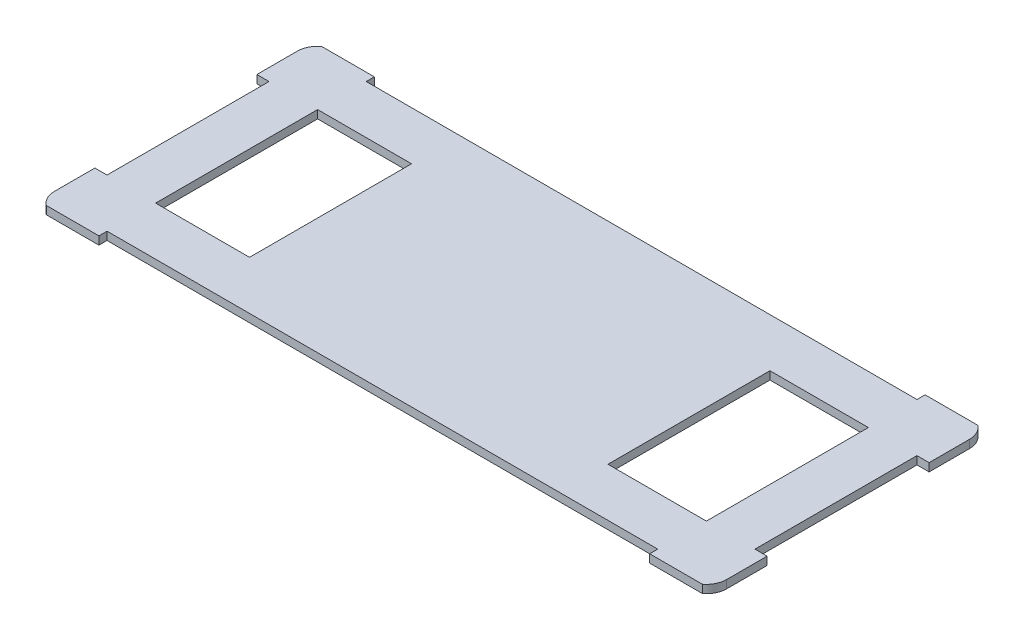
ISO-10303-21;
HEADER;
FILE_DESCRIPTION(('STEP AP214'),'2;1');
FILE_NAME('part.step','',(''),(''),'','','');
FILE_SCHEMA(('AUTOMOTIVE_DESIGN { 1 0 10303 214 1 1 1 1 }'));
ENDSEC;
DATA;
#1=APPLICATION_CONTEXT('core data for automotive mechanical design processes');
#2=APPLICATION_PROTOCOL_DEFINITION('international standard','automotive_design',2000,#1);
#3=PRODUCT_CONTEXT('',#1,'mechanical');
#4=PRODUCT('Part','Part','',(#3));
#5=PRODUCT_RELATED_PRODUCT_CATEGORY('part','',(#4));
#6=PRODUCT_DEFINITION_FORMATION('','',#4);
#7=PRODUCT_DEFINITION_CONTEXT('part definition',#1,'design');
#8=PRODUCT_DEFINITION('design','',#6,#7);
#9=PRODUCT_DEFINITION_SHAPE('','',#8);
#10=(LENGTH_UNIT() NAMED_UNIT(*) SI_UNIT(.MILLI.,.METRE.));
#11=(NAMED_UNIT(*) PLANE_ANGLE_UNIT() SI_UNIT($,.RADIAN.));
#12=(NAMED_UNIT(*) SI_UNIT($,.STERADIAN.) SOLID_ANGLE_UNIT());
#13=UNCERTAINTY_MEASURE_WITH_UNIT(LENGTH_MEASURE(1.E-05),#10,'distance_accuracy_value','');
#14=(GEOMETRIC_REPRESENTATION_CONTEXT(3) GLOBAL_UNCERTAINTY_ASSIGNED_CONTEXT((#13)) GLOBAL_UNIT_ASSIGNED_CONTEXT((#10,
#11,#12)) REPRESENTATION_CONTEXT('',''));
#15=CARTESIAN_POINT('',(0.,0.,0.));
#16=DIRECTION('',(0.,0.,1.));
#17=DIRECTION('',(1.,0.,0.));
#18=AXIS2_PLACEMENT_3D('',#15,#16,#17);
#19=CARTESIAN_POINT('',(-98.3544303797468,-0.0100000000000031,-32.8481012658228));
#20=DIRECTION('',(0.,0.,-1.));
#21=DIRECTION('',(-1.,0.,0.));
#22=AXIS2_PLACEMENT_3D('',#19,#20,#21);
#23=PLANE('',#22);
#24=DIRECTION('',(0.,1.,0.));
#25=VECTOR('',#24,1.);
#26=CARTESIAN_POINT('',(-98.3544303797468,50.,-32.8481012658228));
#27=LINE('',#26,#25);
#28=CARTESIAN_POINT('',(-98.3544303797468,1.,-32.8481012658228));
#29=VERTEX_POINT('',#28);
#30=CARTESIAN_POINT('',(-98.3544303797468,3.,-32.8481012658228));
#31=VERTEX_POINT('',#30);
#32=EDGE_CURVE('E354',#29,#31,#27,.T.);
#33=ORIENTED_EDGE('',*,*,#32,.F.);
#34=DIRECTION('',(1.,0.,0.));
#35=VECTOR('',#34,1.);
#36=CARTESIAN_POINT('',(-98.3544303797468,1.,-32.8481012658228));
#37=LINE('',#36,#35);
#38=CARTESIAN_POINT('',(-95.3544303797468,1.,-32.8481012658228));
#39=VERTEX_POINT('',#38);
#40=EDGE_CURVE('E485',#29,#39,#37,.T.);
#41=ORIENTED_EDGE('',*,*,#40,.T.);
#42=DIRECTION('',(0.,1.,0.));
#43=VECTOR('',#42,1.);
#44=CARTESIAN_POINT('',(-95.3544303797468,-0.0100000000000031,-32.8481012658228));
#45=LINE('',#44,#43);
#46=CARTESIAN_POINT('',(-95.3544303797468,3.,-32.8481012658228));
#47=VERTEX_POINT('',#46);
#48=EDGE_CURVE('E396',#39,#47,#45,.T.);
#49=ORIENTED_EDGE('',*,*,#48,.T.);
#50=DIRECTION('',(-1.,0.,0.));
#51=VECTOR('',#50,1.);
#52=CARTESIAN_POINT('',(0.,3.,-32.8481012658228));
#53=LINE('',#52,#51);
#54=EDGE_CURVE('E386',#47,#31,#53,.T.);
#55=ORIENTED_EDGE('',*,*,#54,.T.);
#56=EDGE_LOOP('',(#33,#41,#49,#55));
#57=FACE_BOUND('',#56,.T.);
#58=ADVANCED_FACE('F33',(#57),#23,.F.);
#59=CARTESIAN_POINT('',(-95.3544303797468,-0.0100000000000031,-32.8481012658228));
#60=DIRECTION('',(1.,0.,0.));
#61=DIRECTION('',(0.,0.,-1.));
#62=AXIS2_PLACEMENT_3D('',#59,#60,#61);
#63=PLANE('',#62);
#64=ORIENTED_EDGE('',*,*,#48,.F.);
#65=DIRECTION('',(0.,0.,1.));
#66=VECTOR('',#65,1.);
#67=CARTESIAN_POINT('',(-95.3544303797468,1.,-32.8481012658228));
#68=LINE('',#67,#66);
#69=CARTESIAN_POINT('',(-95.3544303797468,1.,7.15189873417722));
#70=VERTEX_POINT('',#69);
#71=EDGE_CURVE('E482',#39,#70,#68,.T.);
#72=ORIENTED_EDGE('',*,*,#71,.T.);
#73=DIRECTION('',(0.,1.,0.));
#74=VECTOR('',#73,1.);
#75=CARTESIAN_POINT('',(-95.3544303797468,-0.0100000000000031,7.15189873417722));
#76=LINE('',#75,#74);
#77=CARTESIAN_POINT('',(-95.3544303797468,3.,7.15189873417722));
#78=VERTEX_POINT('',#77);
#79=EDGE_CURVE('E427',#70,#78,#76,.T.);
#80=ORIENTED_EDGE('',*,*,#79,.T.);
#81=DIRECTION('',(0.,0.,-1.));
#82=VECTOR('',#81,1.);
#83=CARTESIAN_POINT('',(-95.3544303797468,3.,0.));
#84=LINE('',#83,#82);
#85=EDGE_CURVE('E432',#78,#47,#84,.T.);
#86=ORIENTED_EDGE('',*,*,#85,.T.);
#87=EDGE_LOOP('',(#64,#72,#80,#86));
#88=FACE_BOUND('',#87,.T.);
#89=ADVANCED_FACE('F537',(#88),#63,.F.);
#90=CARTESIAN_POINT('',(-98.3544303797468,-0.0100000000000031,7.15189873417722));
#91=DIRECTION('',(0.,0.,1.));
#92=DIRECTION('',(1.,0.,0.));
#93=AXIS2_PLACEMENT_3D('',#90,#91,#92);
#94=PLANE('',#93);
#95=ORIENTED_EDGE('',*,*,#79,.F.);
#96=DIRECTION('',(-1.,0.,0.));
#97=VECTOR('',#96,1.);
#98=CARTESIAN_POINT('',(-98.3544303797468,1.,7.15189873417722));
#99=LINE('',#98,#97);
#100=CARTESIAN_POINT('',(-98.3544303797468,1.,7.15189873417722));
#101=VERTEX_POINT('',#100);
#102=EDGE_CURVE('E479',#70,#101,#99,.T.);
#103=ORIENTED_EDGE('',*,*,#102,.T.);
#104=DIRECTION('',(0.,-1.,0.));
#105=VECTOR('',#104,1.);
#106=CARTESIAN_POINT('',(-98.3544303797468,50.,7.15189873417722));
#107=LINE('',#106,#105);
#108=CARTESIAN_POINT('',(-98.3544303797468,3.,7.15189873417722));
#109=VERTEX_POINT('',#108);
#110=EDGE_CURVE('E351',#109,#101,#107,.T.);
#111=ORIENTED_EDGE('',*,*,#110,.F.);
#112=DIRECTION('',(1.,0.,0.));
#113=VECTOR('',#112,1.);
#114=CARTESIAN_POINT('',(0.,3.,7.15189873417733));
#115=LINE('',#114,#113);
#116=EDGE_CURVE('E417',#109,#78,#115,.T.);
#117=ORIENTED_EDGE('',*,*,#116,.T.);
#118=EDGE_LOOP('',(#95,#103,#111,#117));
#119=FACE_BOUND('',#118,.T.);
#120=ADVANCED_FACE('F543',(#119),#94,.F.);
#121=CARTESIAN_POINT('',(-83.3544303797468,-0.0100000000000031,19.1518987341772));
#122=DIRECTION('',(0.,0.,-1.));
#123=DIRECTION('',(-1.,0.,0.));
#124=AXIS2_PLACEMENT_3D('',#121,#122,#123);
#125=PLANE('',#124);
#126=DIRECTION('',(0.,1.,0.));
#127=VECTOR('',#126,1.);
#128=CARTESIAN_POINT('',(-83.3544303797468,-0.0100000000000031,19.1518987341772));
#129=LINE('',#128,#127);
#130=CARTESIAN_POINT('',(-83.3544303797468,1.,19.1518987341772));
#131=VERTEX_POINT('',#130);
#132=CARTESIAN_POINT('',(-83.3544303797468,3.,19.1518987341772));
#133=VERTEX_POINT('',#132);
#134=EDGE_CURVE('E394',#131,#133,#129,.T.);
#135=ORIENTED_EDGE('',*,*,#134,.F.);
#136=DIRECTION('',(1.,0.,0.));
#137=VECTOR('',#136,1.);
#138=CARTESIAN_POINT('',(-83.3544303797468,1.,19.1518987341772));
#139=LINE('',#138,#137);
#140=CARTESIAN_POINT('',(52.6371308016878,1.,19.1518987341772));
#141=VERTEX_POINT('',#140);
#142=EDGE_CURVE('E460',#131,#141,#139,.T.);
#143=ORIENTED_EDGE('',*,*,#142,.T.);
#144=DIRECTION('',(0.,1.,0.));
#145=VECTOR('',#144,1.);
#146=CARTESIAN_POINT('',(52.6371308016878,-0.0100000000000031,19.1518987341772));
#147=LINE('',#146,#145);
#148=CARTESIAN_POINT('',(52.6371308016878,3.,19.1518987341772));
#149=VERTEX_POINT('',#148);
#150=EDGE_CURVE('E397',#141,#149,#147,.T.);
#151=ORIENTED_EDGE('',*,*,#150,.T.);
#152=DIRECTION('',(-1.,0.,0.));
#153=VECTOR('',#152,1.);
#154=CARTESIAN_POINT('',(0.,3.,19.1518987341772));
#155=LINE('',#154,#153);
#156=EDGE_CURVE('E390',#149,#133,#155,.T.);
#157=ORIENTED_EDGE('',*,*,#156,.T.);
#158=EDGE_LOOP('',(#135,#143,#151,#157));
#159=FACE_BOUND('',#158,.T.);
#160=ADVANCED_FACE('F606',(#159),#125,.F.);
#161=CARTESIAN_POINT('',(52.6371308016878,-0.0100000000000031,22.1518987341772));
#162=DIRECTION('',(1.,0.,0.));
#163=DIRECTION('',(0.,0.,-1.));
#164=AXIS2_PLACEMENT_3D('',#161,#162,#163);
#165=PLANE('',#164);
#166=ORIENTED_EDGE('',*,*,#150,.F.);
#167=DIRECTION('',(0.,0.,1.));
#168=VECTOR('',#167,1.);
#169=CARTESIAN_POINT('',(52.6371308016878,1.,22.1518987341772));
#170=LINE('',#169,#168);
#171=CARTESIAN_POINT('',(52.637130801688,1.,21.1483717721465));
#172=VERTEX_POINT('',#171);
#173=EDGE_CURVE('E458',#141,#172,#170,.T.);
#174=ORIENTED_EDGE('',*,*,#173,.T.);
#175=DIRECTION('',(0.,1.,0.));
#176=VECTOR('',#175,1.);
#177=CARTESIAN_POINT('',(52.6371308016878,-0.0100000000000031,21.1483717721465));
#178=LINE('',#177,#176);
#179=CARTESIAN_POINT('',(52.6371308016878,3.,21.1483717721465));
#180=VERTEX_POINT('',#179);
#181=EDGE_CURVE('E308',#172,#180,#178,.T.);
#182=ORIENTED_EDGE('',*,*,#181,.T.);
#183=DIRECTION('',(0.,0.,-1.));
#184=VECTOR('',#183,1.);
#185=CARTESIAN_POINT('',(52.6371308016879,3.,2.43495644026E-13));
#186=LINE('',#185,#184);
#187=EDGE_CURVE('E387',#180,#149,#186,.T.);
#188=ORIENTED_EDGE('',*,*,#187,.T.);
#189=EDGE_LOOP('',(#166,#174,#182,#188));
#190=FACE_BOUND('',#189,.T.);
#191=ADVANCED_FACE('F456',(#190),#165,.F.);
#192=CARTESIAN_POINT('',(-83.3544303797468,-0.0100000000000031,22.1518987341772));
#193=DIRECTION('',(-1.,0.,0.));
#194=DIRECTION('',(0.,0.,1.));
#195=AXIS2_PLACEMENT_3D('',#192,#193,#194);
#196=PLANE('',#195);
#197=DIRECTION('',(0.,-1.,0.));
#198=VECTOR('',#197,1.);
#199=CARTESIAN_POINT('',(-83.3544303797468,-0.0100000000000031,21.1483717721465));
#200=LINE('',#199,#198);
#201=CARTESIAN_POINT('',(-83.3544303797468,3.,21.1483717721465));
#202=VERTEX_POINT('',#201);
#203=CARTESIAN_POINT('',(-83.3544303797468,1.,21.1483717721465));
#204=VERTEX_POINT('',#203);
#205=EDGE_CURVE('E303',#202,#204,#200,.T.);
#206=ORIENTED_EDGE('',*,*,#205,.T.);
#207=DIRECTION('',(0.,0.,-1.));
#208=VECTOR('',#207,1.);
#209=CARTESIAN_POINT('',(-83.3544303797468,1.,22.1518987341772));
#210=LINE('',#209,#208);
#211=EDGE_CURVE('E463',#204,#131,#210,.T.);
#212=ORIENTED_EDGE('',*,*,#211,.T.);
#213=ORIENTED_EDGE('',*,*,#134,.T.);
#214=DIRECTION('',(0.,0.,1.));
#215=VECTOR('',#214,1.);
#216=CARTESIAN_POINT('',(-83.3544303797468,3.,0.));
#217=LINE('',#216,#215);
#218=EDGE_CURVE('E383',#133,#202,#217,.T.);
#219=ORIENTED_EDGE('',*,*,#218,.T.);
#220=EDGE_LOOP('',(#206,#212,#213,#219));
#221=FACE_BOUND('',#220,.T.);
#222=ADVANCED_FACE('F571',(#221),#196,.F.);
#223=CARTESIAN_POINT('',(64.6371308016878,-0.0100000000000031,7.15189873417722));
#224=DIRECTION('',(0.,0.,1.));
#225=DIRECTION('',(1.,0.,0.));
#226=AXIS2_PLACEMENT_3D('',#223,#224,#225);
#227=PLANE('',#226);
#228=DIRECTION('',(0.,1.,0.));
#229=VECTOR('',#228,1.);
#230=CARTESIAN_POINT('',(67.6371308016878,-0.0100000000000031,7.15189873417722));
#231=LINE('',#230,#229);
#232=CARTESIAN_POINT('',(67.6371308016878,1.,7.15189873417722));
#233=VERTEX_POINT('',#232);
#234=CARTESIAN_POINT('',(67.6371308016878,3.,7.15189873417722));
#235=VERTEX_POINT('',#234);
#236=EDGE_CURVE('E415',#233,#235,#231,.T.);
#237=ORIENTED_EDGE('',*,*,#236,.F.);
#238=DIRECTION('',(-1.,0.,0.));
#239=VECTOR('',#238,1.);
#240=CARTESIAN_POINT('',(64.6371308016878,1.,7.15189873417722));
#241=LINE('',#240,#239);
#242=CARTESIAN_POINT('',(64.6371308016878,1.,7.15189873417722));
#243=VERTEX_POINT('',#242);
#244=EDGE_CURVE('E297',#233,#243,#241,.T.);
#245=ORIENTED_EDGE('',*,*,#244,.T.);
#246=DIRECTION('',(0.,1.,0.));
#247=VECTOR('',#246,1.);
#248=CARTESIAN_POINT('',(64.6371308016878,-0.0100000000000031,7.15189873417722));
#249=LINE('',#248,#247);
#250=CARTESIAN_POINT('',(64.6371308016878,3.,7.15189873417722));
#251=VERTEX_POINT('',#250);
#252=EDGE_CURVE('E399',#243,#251,#249,.T.);
#253=ORIENTED_EDGE('',*,*,#252,.T.);
#254=DIRECTION('',(1.,0.,0.));
#255=VECTOR('',#254,1.);
#256=CARTESIAN_POINT('',(0.,3.,7.15189873417722));
#257=LINE('',#256,#255);
#258=EDGE_CURVE('E393',#251,#235,#257,.T.);
#259=ORIENTED_EDGE('',*,*,#258,.T.);
#260=EDGE_LOOP('',(#237,#245,#253,#259));
#261=FACE_BOUND('',#260,.T.);
#262=ADVANCED_FACE('F569',(#261),#227,.F.);
#263=CARTESIAN_POINT('',(64.6371308016878,-0.0100000000000031,-32.8481012658228));
#264=DIRECTION('',(0.,0.,-1.));
#265=DIRECTION('',(-1.,0.,0.));
#266=AXIS2_PLACEMENT_3D('',#263,#264,#265);
#267=PLANE('',#266);
#268=DIRECTION('',(0.,1.,0.));
#269=VECTOR('',#268,1.);
#270=CARTESIAN_POINT('',(64.6371308016878,-0.0100000000000031,-32.8481012658228));
#271=LINE('',#270,#269);
#272=CARTESIAN_POINT('',(64.6371308016878,1.,-32.8481012658228));
#273=VERTEX_POINT('',#272);
#274=CARTESIAN_POINT('',(64.6371308016878,3.,-32.8481012658228));
#275=VERTEX_POINT('',#274);
#276=EDGE_CURVE('E400',#273,#275,#271,.T.);
#277=ORIENTED_EDGE('',*,*,#276,.F.);
#278=DIRECTION('',(1.,0.,0.));
#279=VECTOR('',#278,1.);
#280=CARTESIAN_POINT('',(64.6371308016878,1.,-32.8481012658228));
#281=LINE('',#280,#279);
#282=CARTESIAN_POINT('',(67.6371308016878,1.,-32.8481012658228));
#283=VERTEX_POINT('',#282);
#284=EDGE_CURVE('E294',#273,#283,#281,.T.);
#285=ORIENTED_EDGE('',*,*,#284,.T.);
#286=DIRECTION('',(0.,-1.,0.));
#287=VECTOR('',#286,1.);
#288=CARTESIAN_POINT('',(67.6371308016878,50.,-32.8481012658228));
#289=LINE('',#288,#287);
#290=CARTESIAN_POINT('',(67.6371308016878,3.,-32.8481012658228));
#291=VERTEX_POINT('',#290);
#292=EDGE_CURVE('E355',#291,#283,#289,.T.);
#293=ORIENTED_EDGE('',*,*,#292,.F.);
#294=DIRECTION('',(-1.,0.,0.));
#295=VECTOR('',#294,1.);
#296=CARTESIAN_POINT('',(0.,3.,-32.8481012658228));
#297=LINE('',#296,#295);
#298=EDGE_CURVE('E407',#291,#275,#297,.T.);
#299=ORIENTED_EDGE('',*,*,#298,.T.);
#300=EDGE_LOOP('',(#277,#285,#293,#299));
#301=FACE_BOUND('',#300,.T.);
#302=ADVANCED_FACE('F518',(#301),#267,.F.);
#303=CARTESIAN_POINT('',(64.6371308016878,-0.0100000000000031,7.15189873417722));
#304=DIRECTION('',(-1.,0.,0.));
#305=DIRECTION('',(0.,0.,1.));
#306=AXIS2_PLACEMENT_3D('',#303,#304,#305);
#307=PLANE('',#306);
#308=ORIENTED_EDGE('',*,*,#252,.F.);
#309=DIRECTION('',(0.,0.,-1.));
#310=VECTOR('',#309,1.);
#311=CARTESIAN_POINT('',(64.6371308016878,1.,7.15189873417722));
#312=LINE('',#311,#310);
#313=EDGE_CURVE('E291',#243,#273,#312,.T.);
#314=ORIENTED_EDGE('',*,*,#313,.T.);
#315=ORIENTED_EDGE('',*,*,#276,.T.);
#316=DIRECTION('',(0.,0.,1.));
#317=VECTOR('',#316,1.);
#318=CARTESIAN_POINT('',(64.6371308016878,3.,0.));
#319=LINE('',#318,#317);
#320=EDGE_CURVE('E410',#275,#251,#319,.T.);
#321=ORIENTED_EDGE('',*,*,#320,.T.);
#322=EDGE_LOOP('',(#308,#314,#315,#321));
#323=FACE_BOUND('',#322,.T.);
#324=ADVANCED_FACE('F568',(#323),#307,.F.);
#325=CARTESIAN_POINT('',(52.6371308016878,-0.0100000000000031,-44.8481012658228));
#326=DIRECTION('',(0.,0.,1.));
#327=DIRECTION('',(1.,0.,0.));
#328=AXIS2_PLACEMENT_3D('',#325,#326,#327);
#329=PLANE('',#328);
#330=DIRECTION('',(0.,1.,0.));
#331=VECTOR('',#330,1.);
#332=CARTESIAN_POINT('',(52.6371308016878,-0.0100000000000031,-44.8481012658228));
#333=LINE('',#332,#331);
#334=CARTESIAN_POINT('',(52.6371308016878,1.,-44.8481012658228));
#335=VERTEX_POINT('',#334);
#336=CARTESIAN_POINT('',(52.6371308016878,3.,-44.8481012658228));
#337=VERTEX_POINT('',#336);
#338=EDGE_CURVE('E402',#335,#337,#333,.T.);
#339=ORIENTED_EDGE('',*,*,#338,.F.);
#340=DIRECTION('',(-1.,0.,0.));
#341=VECTOR('',#340,1.);
#342=CARTESIAN_POINT('',(52.6371308016878,1.,-44.8481012658228));
#343=LINE('',#342,#341);
#344=CARTESIAN_POINT('',(-83.3544303797469,1.,-44.8481012658228));
#345=VERTEX_POINT('',#344);
#346=EDGE_CURVE('E258',#335,#345,#343,.T.);
#347=ORIENTED_EDGE('',*,*,#346,.T.);
#348=DIRECTION('',(0.,1.,0.));
#349=VECTOR('',#348,1.);
#350=CARTESIAN_POINT('',(-83.3544303797469,-0.0100000000000031,-44.8481012658228));
#351=LINE('',#350,#349);
#352=CARTESIAN_POINT('',(-83.3544303797469,3.,-44.8481012658228));
#353=VERTEX_POINT('',#352);
#354=EDGE_CURVE('E327',#345,#353,#351,.T.);
#355=ORIENTED_EDGE('',*,*,#354,.T.);
#356=DIRECTION('',(1.,0.,0.));
#357=VECTOR('',#356,1.);
#358=CARTESIAN_POINT('',(0.,3.,-44.8481012658228));
#359=LINE('',#358,#357);
#360=EDGE_CURVE('E423',#353,#337,#359,.T.);
#361=ORIENTED_EDGE('',*,*,#360,.T.);
#362=EDGE_LOOP('',(#339,#347,#355,#361));
#363=FACE_BOUND('',#362,.T.);
#364=ADVANCED_FACE('F498',(#363),#329,.F.);
#365=CARTESIAN_POINT('',(-83.3544303797469,-0.0100000000000031,-44.8481012658228));
#366=DIRECTION('',(-1.,0.,0.));
#367=DIRECTION('',(0.,0.,1.));
#368=AXIS2_PLACEMENT_3D('',#365,#366,#367);
#369=PLANE('',#368);
#370=DIRECTION('',(0.,0.,-1.));
#371=VECTOR('',#370,1.);
#372=CARTESIAN_POINT('',(-83.3544303797469,1.,-44.8481012658228));
#373=LINE('',#372,#371);
#374=CARTESIAN_POINT('',(-83.3544303797469,1.,-46.8481012658228));
#375=VERTEX_POINT('',#374);
#376=EDGE_CURVE('E264',#345,#375,#373,.T.);
#377=ORIENTED_EDGE('',*,*,#376,.T.);
#378=DIRECTION('',(0.,1.,0.));
#379=VECTOR('',#378,1.);
#380=CARTESIAN_POINT('',(-83.3544303797469,-0.0100000000000034,-46.8481012658228));
#381=LINE('',#380,#379);
#382=CARTESIAN_POINT('',(-83.3544303797469,3.,-46.8481012658228));
#383=VERTEX_POINT('',#382);
#384=EDGE_CURVE('E56',#375,#383,#381,.T.);
#385=ORIENTED_EDGE('',*,*,#384,.T.);
#386=DIRECTION('',(0.,0.,1.));
#387=VECTOR('',#386,1.);
#388=CARTESIAN_POINT('',(-83.3544303797469,3.,0.));
#389=LINE('',#388,#387);
#390=EDGE_CURVE('E426',#383,#353,#389,.T.);
#391=ORIENTED_EDGE('',*,*,#390,.T.);
#392=ORIENTED_EDGE('',*,*,#354,.F.);
#393=EDGE_LOOP('',(#377,#385,#391,#392));
#394=FACE_BOUND('',#393,.T.);
#395=ADVANCED_FACE('F495',(#394),#369,.F.);
#396=CARTESIAN_POINT('',(52.6371308016878,-0.0100000000000031,-44.8481012658228));
#397=DIRECTION('',(1.,0.,0.));
#398=DIRECTION('',(0.,0.,-1.));
#399=AXIS2_PLACEMENT_3D('',#396,#397,#398);
#400=PLANE('',#399);
#401=DIRECTION('',(0.,0.,-1.));
#402=VECTOR('',#401,1.);
#403=CARTESIAN_POINT('',(52.6371308016878,3.,0.));
#404=LINE('',#403,#402);
#405=CARTESIAN_POINT('',(52.6371308016878,3.,-46.8481012658228));
#406=VERTEX_POINT('',#405);
#407=EDGE_CURVE('E252',#337,#406,#404,.T.);
#408=ORIENTED_EDGE('',*,*,#407,.T.);
#409=DIRECTION('',(0.,-1.,0.));
#410=VECTOR('',#409,1.);
#411=CARTESIAN_POINT('',(52.6371308016878,-0.0100000000000034,-46.8481012658228));
#412=LINE('',#411,#410);
#413=CARTESIAN_POINT('',(52.637130801688,1.,-46.8481012658228));
#414=VERTEX_POINT('',#413);
#415=EDGE_CURVE('E240',#406,#414,#412,.T.);
#416=ORIENTED_EDGE('',*,*,#415,.T.);
#417=DIRECTION('',(0.,0.,1.));
#418=VECTOR('',#417,1.);
#419=CARTESIAN_POINT('',(52.6371308016878,1.,-44.8481012658228));
#420=LINE('',#419,#418);
#421=EDGE_CURVE('E249',#414,#335,#420,.T.);
#422=ORIENTED_EDGE('',*,*,#421,.T.);
#423=ORIENTED_EDGE('',*,*,#338,.T.);
#424=EDGE_LOOP('',(#408,#416,#422,#423));
#425=FACE_BOUND('',#424,.T.);
#426=ADVANCED_FACE('F248',(#425),#400,.F.);
#427=CARTESIAN_POINT('',(-98.3544303797468,50.,-47.8481012658228));
#428=DIRECTION('',(1.,0.,0.));
#429=DIRECTION('',(0.,0.,-1.));
#430=AXIS2_PLACEMENT_3D('',#427,#428,#429);
#431=PLANE('',#430);
#432=DIRECTION('',(0.,-1.,0.));
#433=VECTOR('',#432,1.);
#434=CARTESIAN_POINT('',(-98.3544303797468,50.,-42.8481012658228));
#435=LINE('',#434,#433);
#436=CARTESIAN_POINT('',(-98.3544303797468,3.,-42.8481012658228));
#437=VERTEX_POINT('',#436);
#438=CARTESIAN_POINT('',(-98.3544303797468,1.,-42.8481012658228));
#439=VERTEX_POINT('',#438);
#440=EDGE_CURVE('E377',#437,#439,#435,.T.);
#441=ORIENTED_EDGE('',*,*,#440,.T.);
#442=DIRECTION('',(0.,0.,1.));
#443=VECTOR('',#442,1.);
#444=CARTESIAN_POINT('',(-98.3544303797468,1.,-47.8481012658228));
#445=LINE('',#444,#443);
#446=EDGE_CURVE('E488',#439,#29,#445,.T.);
#447=ORIENTED_EDGE('',*,*,#446,.T.);
#448=ORIENTED_EDGE('',*,*,#32,.T.);
#449=DIRECTION('',(0.,0.,-1.));
#450=VECTOR('',#449,1.);
#451=CARTESIAN_POINT('',(-98.3544303797468,3.,-47.8481012658228));
#452=LINE('',#451,#450);
#453=EDGE_CURVE('E368',#31,#437,#452,.T.);
#454=ORIENTED_EDGE('',*,*,#453,.T.);
#455=EDGE_LOOP('',(#441,#447,#448,#454));
#456=FACE_BOUND('',#455,.T.);
#457=ADVANCED_FACE('F532',(#456),#431,.F.);
#458=CARTESIAN_POINT('',(-93.3544303797468,50.,-42.8481012658228));
#459=DIRECTION('',(0.,-1.,0.));
#460=DIRECTION('',(0.,0.,-1.));
#461=AXIS2_PLACEMENT_3D('',#458,#459,#460);
#462=CYLINDRICAL_SURFACE('',#461,5.);
#463=DIRECTION('',(0.,-1.,0.));
#464=VECTOR('',#463,1.);
#465=CARTESIAN_POINT('',(-96.3544303797468,50.,-46.8481012658228));
#466=LINE('',#465,#464);
#467=CARTESIAN_POINT('',(-96.3544303797468,1.,-46.8481012658228));
#468=VERTEX_POINT('',#467);
#469=CARTESIAN_POINT('',(-96.3544303797468,3.,-46.8481012658228));
#470=VERTEX_POINT('',#469);
#471=EDGE_CURVE('E505',#468,#470,#466,.F.);
#472=ORIENTED_EDGE('',*,*,#471,.F.);
#473=CARTESIAN_POINT('',(-93.3544303797468,1.,-42.8481012658228));
#474=DIRECTION('',(0.,1.,0.));
#475=DIRECTION('',(0.,0.,1.));
#476=AXIS2_PLACEMENT_3D('',#473,#474,#475);
#477=CIRCLE('',#476,5.);
#478=EDGE_CURVE('E491',#439,#468,#477,.F.);
#479=ORIENTED_EDGE('',*,*,#478,.F.);
#480=ORIENTED_EDGE('',*,*,#440,.F.);
#481=CARTESIAN_POINT('',(-93.3544303797468,3.,-42.8481012658228));
#482=DIRECTION('',(0.,-1.,0.));
#483=DIRECTION('',(0.,0.,-1.));
#484=AXIS2_PLACEMENT_3D('',#481,#482,#483);
#485=CIRCLE('',#484,5.);
#486=EDGE_CURVE('E361',#470,#437,#485,.F.);
#487=ORIENTED_EDGE('',*,*,#486,.F.);
#488=EDGE_LOOP('',(#472,#479,#480,#487));
#489=FACE_BOUND('',#488,.T.);
#490=ADVANCED_FACE('F524',(#489),#462,.T.);
#491=CARTESIAN_POINT('',(62.6371308016877,50.,-42.8481012658228));
#492=DIRECTION('',(0.,-1.,0.));
#493=DIRECTION('',(0.,0.,-1.));
#494=AXIS2_PLACEMENT_3D('',#491,#492,#493);
#495=CYLINDRICAL_SURFACE('',#494,5.);
#496=DIRECTION('',(0.,-1.,0.));
#497=VECTOR('',#496,1.);
#498=CARTESIAN_POINT('',(65.6371308016877,50.,-46.8481012658228));
#499=LINE('',#498,#497);
#500=CARTESIAN_POINT('',(65.6371308016877,3.,-46.8481012658228));
#501=VERTEX_POINT('',#500);
#502=CARTESIAN_POINT('',(65.6371308016878,1.,-46.8481012658228));
#503=VERTEX_POINT('',#502);
#504=EDGE_CURVE('E48',#501,#503,#499,.T.);
#505=ORIENTED_EDGE('',*,*,#504,.F.);
#506=CARTESIAN_POINT('',(62.6371308016877,3.,-42.8481012658228));
#507=DIRECTION('',(0.,-1.,0.));
#508=DIRECTION('',(0.,0.,-1.));
#509=AXIS2_PLACEMENT_3D('',#506,#507,#508);
#510=CIRCLE('',#509,5.);
#511=CARTESIAN_POINT('',(67.6371308016878,3.,-42.8481012658228));
#512=VERTEX_POINT('',#511);
#513=EDGE_CURVE('E358',#512,#501,#510,.F.);
#514=ORIENTED_EDGE('',*,*,#513,.F.);
#515=DIRECTION('',(0.,-1.,0.));
#516=VECTOR('',#515,1.);
#517=CARTESIAN_POINT('',(67.6371308016878,50.,-42.8481012658228));
#518=LINE('',#517,#516);
#519=CARTESIAN_POINT('',(67.6371308016878,1.,-42.8481012658228));
#520=VERTEX_POINT('',#519);
#521=EDGE_CURVE('E371',#520,#512,#518,.F.);
#522=ORIENTED_EDGE('',*,*,#521,.F.);
#523=CARTESIAN_POINT('',(62.6371308016877,1.,-42.8481012658228));
#524=DIRECTION('',(0.,1.,0.));
#525=DIRECTION('',(0.,0.,1.));
#526=AXIS2_PLACEMENT_3D('',#523,#524,#525);
#527=CIRCLE('',#526,5.);
#528=EDGE_CURVE('E260',#503,#520,#527,.F.);
#529=ORIENTED_EDGE('',*,*,#528,.F.);
#530=EDGE_LOOP('',(#505,#514,#522,#529));
#531=FACE_BOUND('',#530,.T.);
#532=ADVANCED_FACE('F522',(#531),#495,.T.);
#533=CARTESIAN_POINT('',(67.6371308016878,50.,-47.8481012658228));
#534=DIRECTION('',(-1.,0.,0.));
#535=DIRECTION('',(0.,0.,1.));
#536=AXIS2_PLACEMENT_3D('',#533,#534,#535);
#537=PLANE('',#536);
#538=ORIENTED_EDGE('',*,*,#292,.T.);
#539=DIRECTION('',(0.,0.,1.));
#540=VECTOR('',#539,1.);
#541=CARTESIAN_POINT('',(67.6371308016878,1.,25.2768642998369));
#542=LINE('',#541,#540);
#543=EDGE_CURVE('E465',#520,#283,#542,.T.);
#544=ORIENTED_EDGE('',*,*,#543,.F.);
#545=ORIENTED_EDGE('',*,*,#521,.T.);
#546=DIRECTION('',(0.,0.,1.));
#547=VECTOR('',#546,1.);
#548=CARTESIAN_POINT('',(67.6371308016878,3.,-47.8481012658228));
#549=LINE('',#548,#547);
#550=EDGE_CURVE('E404',#512,#291,#549,.T.);
#551=ORIENTED_EDGE('',*,*,#550,.T.);
#552=EDGE_LOOP('',(#538,#544,#545,#551));
#553=FACE_BOUND('',#552,.T.);
#554=ADVANCED_FACE('F519',(#553),#537,.F.);
#555=DIRECTION('',(0.,-1.,0.));
#556=VECTOR('',#555,1.);
#557=CARTESIAN_POINT('',(67.6371308016878,50.,17.1518987341772));
#558=LINE('',#557,#556);
#559=CARTESIAN_POINT('',(67.6371308016878,3.,17.1518987341772));
#560=VERTEX_POINT('',#559);
#561=CARTESIAN_POINT('',(67.6371308016878,1.,17.1518987341772));
#562=VERTEX_POINT('',#561);
#563=EDGE_CURVE('E373',#560,#562,#558,.T.);
#564=ORIENTED_EDGE('',*,*,#563,.T.);
#565=EDGE_CURVE('E508',#233,#562,#542,.T.);
#566=ORIENTED_EDGE('',*,*,#565,.F.);
#567=ORIENTED_EDGE('',*,*,#236,.T.);
#568=EDGE_CURVE('E374',#235,#560,#549,.T.);
#569=ORIENTED_EDGE('',*,*,#568,.T.);
#570=EDGE_LOOP('',(#564,#566,#567,#569));
#571=FACE_BOUND('',#570,.T.);
#572=ADVANCED_FACE('F530',(#571),#537,.F.);
#573=CARTESIAN_POINT('',(62.6371308016878,50.,17.1518987341772));
#574=DIRECTION('',(0.,-1.,0.));
#575=DIRECTION('',(0.,0.,-1.));
#576=AXIS2_PLACEMENT_3D('',#573,#574,#575);
#577=CYLINDRICAL_SURFACE('',#576,5.);
#578=CARTESIAN_POINT('',(62.6371308016878,1.,17.1518987341772));
#579=DIRECTION('',(0.,1.,0.));
#580=DIRECTION('',(0.,0.,1.));
#581=AXIS2_PLACEMENT_3D('',#578,#579,#580);
#582=CIRCLE('',#581,5.);
#583=CARTESIAN_POINT('',(65.6418276677268,1.,21.1483717721465));
#584=VERTEX_POINT('',#583);
#585=EDGE_CURVE('E461',#562,#584,#582,.F.);
#586=ORIENTED_EDGE('',*,*,#585,.F.);
#587=ORIENTED_EDGE('',*,*,#563,.F.);
#588=CARTESIAN_POINT('',(62.6371308016878,3.,17.1518987341772));
#589=DIRECTION('',(0.,-1.,0.));
#590=DIRECTION('',(0.,0.,-1.));
#591=AXIS2_PLACEMENT_3D('',#588,#589,#590);
#592=CIRCLE('',#591,5.);
#593=CARTESIAN_POINT('',(65.6418276677268,3.,21.1483717721465));
#594=VERTEX_POINT('',#593);
#595=EDGE_CURVE('E362',#594,#560,#592,.F.);
#596=ORIENTED_EDGE('',*,*,#595,.F.);
#597=DIRECTION('',(0.,-1.,0.));
#598=VECTOR('',#597,1.);
#599=CARTESIAN_POINT('',(65.6418276677268,50.,21.1483717721465));
#600=LINE('',#599,#598);
#601=EDGE_CURVE('E306',#584,#594,#600,.F.);
#602=ORIENTED_EDGE('',*,*,#601,.F.);
#603=EDGE_LOOP('',(#586,#587,#596,#602));
#604=FACE_BOUND('',#603,.T.);
#605=ADVANCED_FACE('F552',(#604),#577,.T.);
#606=CARTESIAN_POINT('',(-93.3544303797468,50.,17.1518987341772));
#607=DIRECTION('',(0.,-1.,0.));
#608=DIRECTION('',(0.,0.,-1.));
#609=AXIS2_PLACEMENT_3D('',#606,#607,#608);
#610=CYLINDRICAL_SURFACE('',#609,5.);
#611=CARTESIAN_POINT('',(-93.3544303797468,1.,17.1518987341772));
#612=DIRECTION('',(0.,1.,0.));
#613=DIRECTION('',(0.,0.,1.));
#614=AXIS2_PLACEMENT_3D('',#611,#612,#613);
#615=CIRCLE('',#614,5.);
#616=CARTESIAN_POINT('',(-96.3591272457855,1.,21.1483717721465));
#617=VERTEX_POINT('',#616);
#618=CARTESIAN_POINT('',(-98.3544303797468,1.,17.1518987341772));
#619=VERTEX_POINT('',#618);
#620=EDGE_CURVE('E474',#617,#619,#615,.F.);
#621=ORIENTED_EDGE('',*,*,#620,.F.);
#622=DIRECTION('',(0.,-1.,0.));
#623=VECTOR('',#622,1.);
#624=CARTESIAN_POINT('',(-96.3591272457859,50.,21.1483717721465));
#625=LINE('',#624,#623);
#626=CARTESIAN_POINT('',(-96.3591272457859,3.,21.1483717721465));
#627=VERTEX_POINT('',#626);
#628=EDGE_CURVE('E300',#627,#617,#625,.T.);
#629=ORIENTED_EDGE('',*,*,#628,.F.);
#630=CARTESIAN_POINT('',(-93.3544303797468,3.,17.1518987341772));
#631=DIRECTION('',(0.,-1.,0.));
#632=DIRECTION('',(0.,0.,-1.));
#633=AXIS2_PLACEMENT_3D('',#630,#631,#632);
#634=CIRCLE('',#633,5.);
#635=CARTESIAN_POINT('',(-98.3544303797468,3.,17.1518987341772));
#636=VERTEX_POINT('',#635);
#637=EDGE_CURVE('E357',#636,#627,#634,.F.);
#638=ORIENTED_EDGE('',*,*,#637,.F.);
#639=DIRECTION('',(0.,-1.,0.));
#640=VECTOR('',#639,1.);
#641=CARTESIAN_POINT('',(-98.3544303797468,50.,17.1518987341772));
#642=LINE('',#641,#640);
#643=EDGE_CURVE('E380',#619,#636,#642,.F.);
#644=ORIENTED_EDGE('',*,*,#643,.F.);
#645=EDGE_LOOP('',(#621,#629,#638,#644));
#646=FACE_BOUND('',#645,.T.);
#647=ADVANCED_FACE('F549',(#646),#610,.T.);
#648=ORIENTED_EDGE('',*,*,#110,.T.);
#649=DIRECTION('',(0.,0.,1.));
#650=VECTOR('',#649,1.);
#651=CARTESIAN_POINT('',(-98.3544303797468,1.,-47.8481012658228));
#652=LINE('',#651,#650);
#653=EDGE_CURVE('E476',#101,#619,#652,.T.);
#654=ORIENTED_EDGE('',*,*,#653,.T.);
#655=ORIENTED_EDGE('',*,*,#643,.T.);
#656=EDGE_CURVE('E364',#636,#109,#452,.T.);
#657=ORIENTED_EDGE('',*,*,#656,.T.);
#658=EDGE_LOOP('',(#648,#654,#655,#657));
#659=FACE_BOUND('',#658,.T.);
#660=ADVANCED_FACE('F551',(#659),#431,.F.);
#661=CARTESIAN_POINT('',(0.,3.,0.));
#662=DIRECTION('',(0.,1.,0.));
#663=DIRECTION('',(0.,0.,1.));
#664=AXIS2_PLACEMENT_3D('',#661,#662,#663);
#665=PLANE('',#664);
#666=DIRECTION('',(1.,0.,0.));
#667=VECTOR('',#666,1.);
#668=CARTESIAN_POINT('',(0.,3.,-46.8481012658228));
#669=LINE('',#668,#667);
#670=EDGE_CURVE('E253',#470,#383,#669,.T.);
#671=ORIENTED_EDGE('',*,*,#670,.F.);
#672=ORIENTED_EDGE('',*,*,#486,.T.);
#673=ORIENTED_EDGE('',*,*,#453,.F.);
#674=ORIENTED_EDGE('',*,*,#54,.F.);
#675=ORIENTED_EDGE('',*,*,#85,.F.);
#676=ORIENTED_EDGE('',*,*,#116,.F.);
#677=ORIENTED_EDGE('',*,*,#656,.F.);
#678=ORIENTED_EDGE('',*,*,#637,.T.);
#679=DIRECTION('',(-1.,0.,0.));
#680=VECTOR('',#679,1.);
#681=CARTESIAN_POINT('',(0.,3.,21.1483717721465));
#682=LINE('',#681,#680);
#683=EDGE_CURVE('E382',#202,#627,#682,.T.);
#684=ORIENTED_EDGE('',*,*,#683,.F.);
#685=ORIENTED_EDGE('',*,*,#218,.F.);
#686=ORIENTED_EDGE('',*,*,#156,.F.);
#687=ORIENTED_EDGE('',*,*,#187,.F.);
#688=EDGE_CURVE('E439',#594,#180,#682,.T.);
#689=ORIENTED_EDGE('',*,*,#688,.F.);
#690=ORIENTED_EDGE('',*,*,#595,.T.);
#691=ORIENTED_EDGE('',*,*,#568,.F.);
#692=ORIENTED_EDGE('',*,*,#258,.F.);
#693=ORIENTED_EDGE('',*,*,#320,.F.);
#694=ORIENTED_EDGE('',*,*,#298,.F.);
#695=ORIENTED_EDGE('',*,*,#550,.F.);
#696=ORIENTED_EDGE('',*,*,#513,.T.);
#697=EDGE_CURVE('E500',#406,#501,#669,.T.);
#698=ORIENTED_EDGE('',*,*,#697,.F.);
#699=ORIENTED_EDGE('',*,*,#407,.F.);
#700=ORIENTED_EDGE('',*,*,#360,.F.);
#701=ORIENTED_EDGE('',*,*,#390,.F.);
#702=EDGE_LOOP('',(#671,#672,#673,#674,#675,#676,#677,#678,#684,#685,#686,#687,#689,#690,#691,
#692,#693,#694,#695,#696,#698,#699,#700,#701));
#703=FACE_BOUND('',#702,.T.);
#704=DIRECTION('',(0.,0.,1.));
#705=VECTOR('',#704,1.);
#706=CARTESIAN_POINT('',(-83.3544303797469,3.,-32.8481012658228));
#707=LINE('',#706,#705);
#708=CARTESIAN_POINT('',(-83.3544303797469,3.,-32.8481012658228));
#709=VERTEX_POINT('',#708);
#710=CARTESIAN_POINT('',(-83.3544303797469,3.,7.15189873417722));
#711=VERTEX_POINT('',#710);
#712=EDGE_CURVE('E311',#709,#711,#707,.T.);
#713=ORIENTED_EDGE('',*,*,#712,.F.);
#714=DIRECTION('',(-1.,0.,0.));
#715=VECTOR('',#714,1.);
#716=CARTESIAN_POINT('',(-83.3544303797469,3.,-32.8481012658228));
#717=LINE('',#716,#715);
#718=CARTESIAN_POINT('',(-60.1690754929075,3.,-32.8481012658228));
#719=VERTEX_POINT('',#718);
#720=EDGE_CURVE('E321',#719,#709,#717,.T.);
#721=ORIENTED_EDGE('',*,*,#720,.F.);
#722=DIRECTION('',(0.,0.,-1.));
#723=VECTOR('',#722,1.);
#724=CARTESIAN_POINT('',(-60.1690754929075,3.,-32.8481012658228));
#725=LINE('',#724,#723);
#726=CARTESIAN_POINT('',(-60.1690754929075,3.,7.15189873417722));
#727=VERTEX_POINT('',#726);
#728=EDGE_CURVE('E318',#727,#719,#725,.T.);
#729=ORIENTED_EDGE('',*,*,#728,.F.);
#730=DIRECTION('',(1.,0.,0.));
#731=VECTOR('',#730,1.);
#732=CARTESIAN_POINT('',(-83.3544303797469,3.,7.15189873417722));
#733=LINE('',#732,#731);
#734=EDGE_CURVE('E314',#711,#727,#733,.T.);
#735=ORIENTED_EDGE('',*,*,#734,.F.);
#736=EDGE_LOOP('',(#713,#721,#729,#735));
#737=FACE_BOUND('',#736,.T.);
#738=DIRECTION('',(0.,0.,1.));
#739=VECTOR('',#738,1.);
#740=CARTESIAN_POINT('',(28.3369496985897,3.,7.15189873417722));
#741=LINE('',#740,#739);
#742=CARTESIAN_POINT('',(28.3369496985897,3.,-32.8481012658228));
#743=VERTEX_POINT('',#742);
#744=CARTESIAN_POINT('',(28.3369496985897,3.,7.15189873417722));
#745=VERTEX_POINT('',#744);
#746=EDGE_CURVE('E310',#743,#745,#741,.T.);
#747=ORIENTED_EDGE('',*,*,#746,.F.);
#748=DIRECTION('',(-1.,0.,0.));
#749=VECTOR('',#748,1.);
#750=CARTESIAN_POINT('',(28.3369496985897,3.,-32.8481012658228));
#751=LINE('',#750,#749);
#752=CARTESIAN_POINT('',(52.6371308016878,3.,-32.8481012658228));
#753=VERTEX_POINT('',#752);
#754=EDGE_CURVE('E341',#753,#743,#751,.T.);
#755=ORIENTED_EDGE('',*,*,#754,.F.);
#756=DIRECTION('',(0.,0.,-1.));
#757=VECTOR('',#756,1.);
#758=CARTESIAN_POINT('',(52.6371308016878,3.,7.15189873417722));
#759=LINE('',#758,#757);
#760=CARTESIAN_POINT('',(52.6371308016878,3.,7.15189873417722));
#761=VERTEX_POINT('',#760);
#762=EDGE_CURVE('E338',#761,#753,#759,.T.);
#763=ORIENTED_EDGE('',*,*,#762,.F.);
#764=DIRECTION('',(1.,0.,0.));
#765=VECTOR('',#764,1.);
#766=CARTESIAN_POINT('',(28.3369496985897,3.,7.15189873417722));
#767=LINE('',#766,#765);
#768=EDGE_CURVE('E335',#745,#761,#767,.T.);
#769=ORIENTED_EDGE('',*,*,#768,.F.);
#770=EDGE_LOOP('',(#747,#755,#763,#769));
#771=FACE_BOUND('',#770,.T.);
#772=ADVANCED_FACE('F35',(#703,#737,#771),#665,.T.);
#773=CARTESIAN_POINT('',(28.3369496985897,0.,7.15189873417722));
#774=DIRECTION('',(-1.,0.,0.));
#775=DIRECTION('',(0.,0.,1.));
#776=AXIS2_PLACEMENT_3D('',#773,#774,#775);
#777=PLANE('',#776);
#778=DIRECTION('',(0.,1.,0.));
#779=VECTOR('',#778,1.);
#780=CARTESIAN_POINT('',(28.3369496985897,0.,7.15189873417722));
#781=LINE('',#780,#779);
#782=CARTESIAN_POINT('',(28.3369496985897,1.,7.15189873417722));
#783=VERTEX_POINT('',#782);
#784=EDGE_CURVE('E344',#783,#745,#781,.T.);
#785=ORIENTED_EDGE('',*,*,#784,.F.);
#786=DIRECTION('',(0.,0.,-1.));
#787=VECTOR('',#786,1.);
#788=CARTESIAN_POINT('',(28.3369496985897,1.,7.15189873417722));
#789=LINE('',#788,#787);
#790=CARTESIAN_POINT('',(28.3369496985897,1.,-32.8481012658228));
#791=VERTEX_POINT('',#790);
#792=EDGE_CURVE('E288',#783,#791,#789,.T.);
#793=ORIENTED_EDGE('',*,*,#792,.T.);
#794=DIRECTION('',(0.,1.,0.));
#795=VECTOR('',#794,1.);
#796=CARTESIAN_POINT('',(28.3369496985897,0.,-32.8481012658228));
#797=LINE('',#796,#795);
#798=EDGE_CURVE('E315',#791,#743,#797,.T.);
#799=ORIENTED_EDGE('',*,*,#798,.T.);
#800=ORIENTED_EDGE('',*,*,#746,.T.);
#801=EDGE_LOOP('',(#785,#793,#799,#800));
#802=FACE_BOUND('',#801,.T.);
#803=ADVANCED_FACE('F593',(#802),#777,.F.);
#804=CARTESIAN_POINT('',(28.3369496985897,0.,-32.8481012658228));
#805=DIRECTION('',(0.,0.,-1.));
#806=DIRECTION('',(-1.,0.,0.));
#807=AXIS2_PLACEMENT_3D('',#804,#805,#806);
#808=PLANE('',#807);
#809=ORIENTED_EDGE('',*,*,#798,.F.);
#810=DIRECTION('',(1.,0.,0.));
#811=VECTOR('',#810,1.);
#812=CARTESIAN_POINT('',(28.3369496985897,1.,-32.8481012658228));
#813=LINE('',#812,#811);
#814=CARTESIAN_POINT('',(52.6371308016878,1.,-32.8481012658228));
#815=VERTEX_POINT('',#814);
#816=EDGE_CURVE('E285',#791,#815,#813,.T.);
#817=ORIENTED_EDGE('',*,*,#816,.T.);
#818=DIRECTION('',(0.,1.,0.));
#819=VECTOR('',#818,1.);
#820=CARTESIAN_POINT('',(52.6371308016878,0.,-32.8481012658228));
#821=LINE('',#820,#819);
#822=EDGE_CURVE('E346',#815,#753,#821,.T.);
#823=ORIENTED_EDGE('',*,*,#822,.T.);
#824=ORIENTED_EDGE('',*,*,#754,.T.);
#825=EDGE_LOOP('',(#809,#817,#823,#824));
#826=FACE_BOUND('',#825,.T.);
#827=ADVANCED_FACE('F599',(#826),#808,.F.);
#828=CARTESIAN_POINT('',(52.6371308016878,0.,7.15189873417722));
#829=DIRECTION('',(1.,0.,0.));
#830=DIRECTION('',(0.,0.,-1.));
#831=AXIS2_PLACEMENT_3D('',#828,#829,#830);
#832=PLANE('',#831);
#833=ORIENTED_EDGE('',*,*,#822,.F.);
#834=DIRECTION('',(0.,0.,1.));
#835=VECTOR('',#834,1.);
#836=CARTESIAN_POINT('',(52.6371308016878,1.,7.15189873417722));
#837=LINE('',#836,#835);
#838=CARTESIAN_POINT('',(52.6371308016878,1.,7.15189873417722));
#839=VERTEX_POINT('',#838);
#840=EDGE_CURVE('E282',#815,#839,#837,.T.);
#841=ORIENTED_EDGE('',*,*,#840,.T.);
#842=DIRECTION('',(0.,1.,0.));
#843=VECTOR('',#842,1.);
#844=CARTESIAN_POINT('',(52.6371308016878,0.,7.15189873417722));
#845=LINE('',#844,#843);
#846=EDGE_CURVE('E348',#839,#761,#845,.T.);
#847=ORIENTED_EDGE('',*,*,#846,.T.);
#848=ORIENTED_EDGE('',*,*,#762,.T.);
#849=EDGE_LOOP('',(#833,#841,#847,#848));
#850=FACE_BOUND('',#849,.T.);
#851=ADVANCED_FACE('F720',(#850),#832,.F.);
#852=CARTESIAN_POINT('',(28.3369496985897,0.,7.15189873417722));
#853=DIRECTION('',(0.,0.,1.));
#854=DIRECTION('',(1.,0.,0.));
#855=AXIS2_PLACEMENT_3D('',#852,#853,#854);
#856=PLANE('',#855);
#857=ORIENTED_EDGE('',*,*,#846,.F.);
#858=DIRECTION('',(-1.,0.,0.));
#859=VECTOR('',#858,1.);
#860=CARTESIAN_POINT('',(28.3369496985897,1.,7.15189873417722));
#861=LINE('',#860,#859);
#862=EDGE_CURVE('E279',#839,#783,#861,.T.);
#863=ORIENTED_EDGE('',*,*,#862,.T.);
#864=ORIENTED_EDGE('',*,*,#784,.T.);
#865=ORIENTED_EDGE('',*,*,#768,.T.);
#866=EDGE_LOOP('',(#857,#863,#864,#865));
#867=FACE_BOUND('',#866,.T.);
#868=ADVANCED_FACE('F730',(#867),#856,.F.);
#869=CARTESIAN_POINT('',(-83.3544303797469,0.,-32.8481012658228));
#870=DIRECTION('',(-1.,0.,0.));
#871=DIRECTION('',(0.,0.,1.));
#872=AXIS2_PLACEMENT_3D('',#869,#870,#871);
#873=PLANE('',#872);
#874=DIRECTION('',(0.,1.,0.));
#875=VECTOR('',#874,1.);
#876=CARTESIAN_POINT('',(-83.3544303797469,0.,7.15189873417722));
#877=LINE('',#876,#875);
#878=CARTESIAN_POINT('',(-83.3544303797469,1.,7.15189873417722));
#879=VERTEX_POINT('',#878);
#880=EDGE_CURVE('E324',#879,#711,#877,.T.);
#881=ORIENTED_EDGE('',*,*,#880,.F.);
#882=DIRECTION('',(0.,0.,-1.));
#883=VECTOR('',#882,1.);
#884=CARTESIAN_POINT('',(-83.3544303797469,1.,-32.8481012658228));
#885=LINE('',#884,#883);
#886=CARTESIAN_POINT('',(-83.3544303797469,1.,-32.8481012658228));
#887=VERTEX_POINT('',#886);
#888=EDGE_CURVE('E276',#879,#887,#885,.T.);
#889=ORIENTED_EDGE('',*,*,#888,.T.);
#890=DIRECTION('',(0.,1.,0.));
#891=VECTOR('',#890,1.);
#892=CARTESIAN_POINT('',(-83.3544303797469,0.,-32.8481012658228));
#893=LINE('',#892,#891);
#894=EDGE_CURVE('E325',#887,#709,#893,.T.);
#895=ORIENTED_EDGE('',*,*,#894,.T.);
#896=ORIENTED_EDGE('',*,*,#712,.T.);
#897=EDGE_LOOP('',(#881,#889,#895,#896));
#898=FACE_BOUND('',#897,.T.);
#899=ADVANCED_FACE('F740',(#898),#873,.F.);
#900=CARTESIAN_POINT('',(-83.3544303797469,0.,-32.8481012658228));
#901=DIRECTION('',(0.,0.,-1.));
#902=DIRECTION('',(-1.,0.,0.));
#903=AXIS2_PLACEMENT_3D('',#900,#901,#902);
#904=PLANE('',#903);
#905=ORIENTED_EDGE('',*,*,#894,.F.);
#906=DIRECTION('',(1.,0.,0.));
#907=VECTOR('',#906,1.);
#908=CARTESIAN_POINT('',(-83.3544303797469,1.,-32.8481012658228));
#909=LINE('',#908,#907);
#910=CARTESIAN_POINT('',(-60.1690754929075,1.,-32.8481012658228));
#911=VERTEX_POINT('',#910);
#912=EDGE_CURVE('E273',#887,#911,#909,.T.);
#913=ORIENTED_EDGE('',*,*,#912,.T.);
#914=DIRECTION('',(0.,1.,0.));
#915=VECTOR('',#914,1.);
#916=CARTESIAN_POINT('',(-60.1690754929075,0.,-32.8481012658228));
#917=LINE('',#916,#915);
#918=EDGE_CURVE('E328',#911,#719,#917,.T.);
#919=ORIENTED_EDGE('',*,*,#918,.T.);
#920=ORIENTED_EDGE('',*,*,#720,.T.);
#921=EDGE_LOOP('',(#905,#913,#919,#920));
#922=FACE_BOUND('',#921,.T.);
#923=ADVANCED_FACE('F750',(#922),#904,.F.);
#924=CARTESIAN_POINT('',(-60.1690754929075,0.,-32.8481012658228));
#925=DIRECTION('',(1.,0.,0.));
#926=DIRECTION('',(0.,0.,-1.));
#927=AXIS2_PLACEMENT_3D('',#924,#925,#926);
#928=PLANE('',#927);
#929=ORIENTED_EDGE('',*,*,#918,.F.);
#930=DIRECTION('',(0.,0.,1.));
#931=VECTOR('',#930,1.);
#932=CARTESIAN_POINT('',(-60.1690754929075,1.,-32.8481012658228));
#933=LINE('',#932,#931);
#934=CARTESIAN_POINT('',(-60.1690754929075,1.,7.15189873417722));
#935=VERTEX_POINT('',#934);
#936=EDGE_CURVE('E270',#911,#935,#933,.T.);
#937=ORIENTED_EDGE('',*,*,#936,.T.);
#938=DIRECTION('',(0.,1.,0.));
#939=VECTOR('',#938,1.);
#940=CARTESIAN_POINT('',(-60.1690754929075,0.,7.15189873417722));
#941=LINE('',#940,#939);
#942=EDGE_CURVE('E330',#935,#727,#941,.T.);
#943=ORIENTED_EDGE('',*,*,#942,.T.);
#944=ORIENTED_EDGE('',*,*,#728,.T.);
#945=EDGE_LOOP('',(#929,#937,#943,#944));
#946=FACE_BOUND('',#945,.T.);
#947=ADVANCED_FACE('F760',(#946),#928,.F.);
#948=CARTESIAN_POINT('',(-83.3544303797469,0.,7.15189873417722));
#949=DIRECTION('',(0.,0.,1.));
#950=DIRECTION('',(1.,0.,0.));
#951=AXIS2_PLACEMENT_3D('',#948,#949,#950);
#952=PLANE('',#951);
#953=ORIENTED_EDGE('',*,*,#942,.F.);
#954=DIRECTION('',(-1.,0.,0.));
#955=VECTOR('',#954,1.);
#956=CARTESIAN_POINT('',(-83.3544303797469,1.,7.15189873417722));
#957=LINE('',#956,#955);
#958=EDGE_CURVE('E262',#935,#879,#957,.T.);
#959=ORIENTED_EDGE('',*,*,#958,.T.);
#960=ORIENTED_EDGE('',*,*,#880,.T.);
#961=ORIENTED_EDGE('',*,*,#734,.T.);
#962=EDGE_LOOP('',(#953,#959,#960,#961));
#963=FACE_BOUND('',#962,.T.);
#964=ADVANCED_FACE('F770',(#963),#952,.F.);
#965=CARTESIAN_POINT('',(-3395.16286919831,47.,21.1483717721465));
#966=DIRECTION('',(0.,0.,-1.));
#967=DIRECTION('',(-1.,0.,0.));
#968=AXIS2_PLACEMENT_3D('',#965,#966,#967);
#969=PLANE('',#968);
#970=ORIENTED_EDGE('',*,*,#628,.T.);
#971=DIRECTION('',(1.,0.,0.));
#972=VECTOR('',#971,1.);
#973=CARTESIAN_POINT('',(-3395.16286919831,1.,21.1483717721465));
#974=LINE('',#973,#972);
#975=EDGE_CURVE('E471',#617,#204,#974,.T.);
#976=ORIENTED_EDGE('',*,*,#975,.T.);
#977=ORIENTED_EDGE('',*,*,#205,.F.);
#978=ORIENTED_EDGE('',*,*,#683,.T.);
#979=EDGE_LOOP('',(#970,#976,#977,#978));
#980=FACE_BOUND('',#979,.T.);
#981=ADVANCED_FACE('F780',(#980),#969,.F.);
#982=ORIENTED_EDGE('',*,*,#181,.F.);
#983=DIRECTION('',(1.,0.,0.));
#984=VECTOR('',#983,1.);
#985=CARTESIAN_POINT('',(-3395.16286919831,1.,21.1483717721465));
#986=LINE('',#985,#984);
#987=EDGE_CURVE('E245',#172,#584,#986,.T.);
#988=ORIENTED_EDGE('',*,*,#987,.T.);
#989=ORIENTED_EDGE('',*,*,#601,.T.);
#990=ORIENTED_EDGE('',*,*,#688,.T.);
#991=EDGE_LOOP('',(#982,#988,#989,#990));
#992=FACE_BOUND('',#991,.T.);
#993=ADVANCED_FACE('F447',(#992),#969,.F.);
#994=CARTESIAN_POINT('',(-3395.16286919831,1.,25.2768642998369));
#995=DIRECTION('',(0.,1.,0.));
#996=DIRECTION('',(0.,0.,1.));
#997=AXIS2_PLACEMENT_3D('',#994,#995,#996);
#998=PLANE('',#997);
#999=ORIENTED_EDGE('',*,*,#958,.F.);
#1000=ORIENTED_EDGE('',*,*,#936,.F.);
#1001=ORIENTED_EDGE('',*,*,#912,.F.);
#1002=ORIENTED_EDGE('',*,*,#888,.F.);
#1003=EDGE_LOOP('',(#999,#1000,#1001,#1002));
#1004=FACE_BOUND('',#1003,.T.);
#1005=ORIENTED_EDGE('',*,*,#862,.F.);
#1006=ORIENTED_EDGE('',*,*,#840,.F.);
#1007=ORIENTED_EDGE('',*,*,#816,.F.);
#1008=ORIENTED_EDGE('',*,*,#792,.F.);
#1009=EDGE_LOOP('',(#1005,#1006,#1007,#1008));
#1010=FACE_BOUND('',#1009,.T.);
#1011=ORIENTED_EDGE('',*,*,#478,.T.);
#1012=DIRECTION('',(1.,0.,0.));
#1013=VECTOR('',#1012,1.);
#1014=CARTESIAN_POINT('',(-3395.16286919831,1.,-46.8481012658228));
#1015=LINE('',#1014,#1013);
#1016=EDGE_CURVE('E11',#468,#375,#1015,.T.);
#1017=ORIENTED_EDGE('',*,*,#1016,.T.);
#1018=ORIENTED_EDGE('',*,*,#376,.F.);
#1019=ORIENTED_EDGE('',*,*,#346,.F.);
#1020=ORIENTED_EDGE('',*,*,#421,.F.);
#1021=EDGE_CURVE('E37',#414,#503,#1015,.T.);
#1022=ORIENTED_EDGE('',*,*,#1021,.T.);
#1023=ORIENTED_EDGE('',*,*,#528,.T.);
#1024=ORIENTED_EDGE('',*,*,#543,.T.);
#1025=ORIENTED_EDGE('',*,*,#284,.F.);
#1026=ORIENTED_EDGE('',*,*,#313,.F.);
#1027=ORIENTED_EDGE('',*,*,#244,.F.);
#1028=ORIENTED_EDGE('',*,*,#565,.T.);
#1029=ORIENTED_EDGE('',*,*,#585,.T.);
#1030=ORIENTED_EDGE('',*,*,#987,.F.);
#1031=ORIENTED_EDGE('',*,*,#173,.F.);
#1032=ORIENTED_EDGE('',*,*,#142,.F.);
#1033=ORIENTED_EDGE('',*,*,#211,.F.);
#1034=ORIENTED_EDGE('',*,*,#975,.F.);
#1035=ORIENTED_EDGE('',*,*,#620,.T.);
#1036=ORIENTED_EDGE('',*,*,#653,.F.);
#1037=ORIENTED_EDGE('',*,*,#102,.F.);
#1038=ORIENTED_EDGE('',*,*,#71,.F.);
#1039=ORIENTED_EDGE('',*,*,#40,.F.);
#1040=ORIENTED_EDGE('',*,*,#446,.F.);
#1041=EDGE_LOOP('',(#1011,#1017,#1018,#1019,#1020,#1022,#1023,#1024,#1025,#1026,#1027,#1028,
#1029,#1030,#1031,#1032,#1033,#1034,#1035,#1036,#1037,#1038,#1039,#1040));
#1042=FACE_BOUND('',#1041,.T.);
#1043=ADVANCED_FACE('F256',(#1004,#1010,#1042),#998,.F.);
#1044=CARTESIAN_POINT('',(3364.44556962025,48.5035448317772,-46.8481012658228));
#1045=DIRECTION('',(0.,0.,1.));
#1046=DIRECTION('',(0.,-1.,0.));
#1047=AXIS2_PLACEMENT_3D('',#1044,#1045,#1046);
#1048=PLANE('',#1047);
#1049=ORIENTED_EDGE('',*,*,#697,.T.);
#1050=ORIENTED_EDGE('',*,*,#504,.T.);
#1051=ORIENTED_EDGE('',*,*,#1021,.F.);
#1052=ORIENTED_EDGE('',*,*,#415,.F.);
#1053=EDGE_LOOP('',(#1049,#1050,#1051,#1052));
#1054=FACE_BOUND('',#1053,.T.);
#1055=ADVANCED_FACE('F239',(#1054),#1048,.F.);
#1056=ORIENTED_EDGE('',*,*,#1016,.F.);
#1057=ORIENTED_EDGE('',*,*,#471,.T.);
#1058=ORIENTED_EDGE('',*,*,#670,.T.);
#1059=ORIENTED_EDGE('',*,*,#384,.F.);
#1060=EDGE_LOOP('',(#1056,#1057,#1058,#1059));
#1061=FACE_BOUND('',#1060,.T.);
#1062=ADVANCED_FACE('F815',(#1061),#1048,.F.);
#1063=CLOSED_SHELL('',(#58,#89,#120,#160,#191,#222,#262,#302,#324,#364,#395,#426,#457,#490,#532,
#554,#572,#605,#647,#660,#772,#803,#827,#851,#868,#899,#923,#947,#964,#981,#993,#1043,#1055,#1062));
#1064=MANIFOLD_SOLID_BREP('B2',#1063);
#1065=ADVANCED_BREP_SHAPE_REPRESENTATION('',(#18,#1064),#14);
#1066=SHAPE_DEFINITION_REPRESENTATION(#9,#1065);
ENDSEC;
END-ISO-10303-21;
